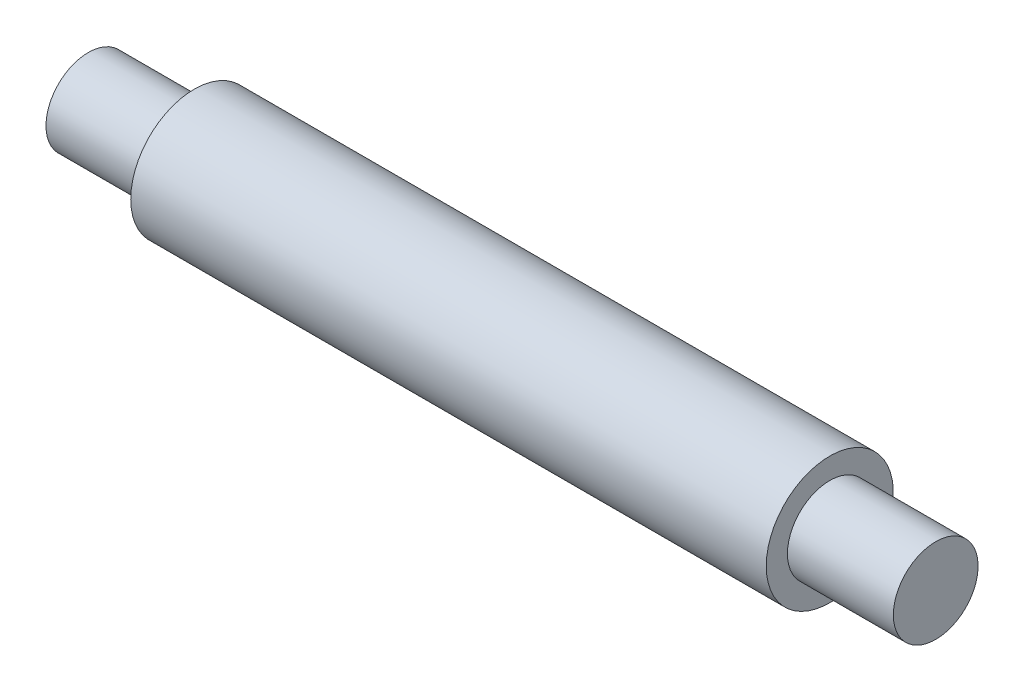
ISO-10303-21;
HEADER;
FILE_DESCRIPTION(('STEP AP214'),'2;1');
FILE_NAME('part.step','',(''),(''),'','','');
FILE_SCHEMA(('AUTOMOTIVE_DESIGN { 1 0 10303 214 1 1 1 1 }'));
ENDSEC;
DATA;
#1=APPLICATION_CONTEXT('core data for automotive mechanical design processes');
#2=APPLICATION_PROTOCOL_DEFINITION('international standard','automotive_design',2000,#1);
#3=PRODUCT_CONTEXT('',#1,'mechanical');
#4=PRODUCT('Part','Part','',(#3));
#5=PRODUCT_RELATED_PRODUCT_CATEGORY('part','',(#4));
#6=PRODUCT_DEFINITION_FORMATION('','',#4);
#7=PRODUCT_DEFINITION_CONTEXT('part definition',#1,'design');
#8=PRODUCT_DEFINITION('design','',#6,#7);
#9=PRODUCT_DEFINITION_SHAPE('','',#8);
#10=(LENGTH_UNIT() NAMED_UNIT(*) SI_UNIT(.MILLI.,.METRE.));
#11=(NAMED_UNIT(*) PLANE_ANGLE_UNIT() SI_UNIT($,.RADIAN.));
#12=(NAMED_UNIT(*) SI_UNIT($,.STERADIAN.) SOLID_ANGLE_UNIT());
#13=UNCERTAINTY_MEASURE_WITH_UNIT(LENGTH_MEASURE(1.E-05),#10,'distance_accuracy_value','');
#14=(GEOMETRIC_REPRESENTATION_CONTEXT(3) GLOBAL_UNCERTAINTY_ASSIGNED_CONTEXT((#13)) GLOBAL_UNIT_ASSIGNED_CONTEXT((#10,
#11,#12)) REPRESENTATION_CONTEXT('',''));
#15=CARTESIAN_POINT('',(0.,0.,0.));
#16=DIRECTION('',(0.,0.,1.));
#17=DIRECTION('',(1.,0.,0.));
#18=AXIS2_PLACEMENT_3D('',#15,#16,#17);
#19=CARTESIAN_POINT('',(0.,0.,0.));
#20=DIRECTION('',(1.,0.,0.));
#21=DIRECTION('',(0.,0.,-1.));
#22=AXIS2_PLACEMENT_3D('',#19,#20,#21);
#23=PLANE('',#22);
#24=CARTESIAN_POINT('',(0.,0.,0.));
#25=DIRECTION('',(-1.,0.,0.));
#26=DIRECTION('',(0.,0.,1.));
#27=AXIS2_PLACEMENT_3D('',#24,#25,#26);
#28=CIRCLE('',#27,4.);
#29=CARTESIAN_POINT('',(0.,0.,4.));
#30=VERTEX_POINT('',#29);
#31=EDGE_CURVE('E10',#30,#30,#28,.T.);
#32=ORIENTED_EDGE('',*,*,#31,.T.);
#33=EDGE_LOOP('',(#32));
#34=FACE_BOUND('',#33,.T.);
#35=ADVANCED_FACE('F37',(#34),#23,.F.);
#36=CARTESIAN_POINT('',(0.,0.,0.));
#37=DIRECTION('',(-1.,0.,0.));
#38=DIRECTION('',(0.,0.,1.));
#39=AXIS2_PLACEMENT_3D('',#36,#37,#38);
#40=CYLINDRICAL_SURFACE('',#39,4.);
#41=ORIENTED_EDGE('',*,*,#31,.F.);
#42=EDGE_LOOP('',(#41));
#43=FACE_BOUND('',#42,.T.);
#44=CARTESIAN_POINT('',(10.,0.,0.));
#45=DIRECTION('',(-1.,0.,0.));
#46=DIRECTION('',(0.,0.,1.));
#47=AXIS2_PLACEMENT_3D('',#44,#45,#46);
#48=CIRCLE('',#47,4.);
#49=CARTESIAN_POINT('',(10.,0.,4.));
#50=VERTEX_POINT('',#49);
#51=EDGE_CURVE('E44',#50,#50,#48,.T.);
#52=ORIENTED_EDGE('',*,*,#51,.T.);
#53=EDGE_LOOP('',(#52));
#54=FACE_BOUND('',#53,.T.);
#55=ADVANCED_FACE('F81',(#43,#54),#40,.T.);
#56=CARTESIAN_POINT('',(10.,4.,0.));
#57=DIRECTION('',(1.,0.,0.));
#58=DIRECTION('',(0.,0.,-1.));
#59=AXIS2_PLACEMENT_3D('',#56,#57,#58);
#60=PLANE('',#59);
#61=ORIENTED_EDGE('',*,*,#51,.F.);
#62=EDGE_LOOP('',(#61));
#63=FACE_BOUND('',#62,.T.);
#64=CARTESIAN_POINT('',(10.,0.,0.));
#65=DIRECTION('',(-1.,0.,0.));
#66=DIRECTION('',(0.,0.,1.));
#67=AXIS2_PLACEMENT_3D('',#64,#65,#66);
#68=CIRCLE('',#67,6.);
#69=CARTESIAN_POINT('',(10.,0.,6.));
#70=VERTEX_POINT('',#69);
#71=EDGE_CURVE('E49',#70,#70,#68,.T.);
#72=ORIENTED_EDGE('',*,*,#71,.T.);
#73=EDGE_LOOP('',(#72));
#74=FACE_BOUND('',#73,.T.);
#75=ADVANCED_FACE('F85',(#63,#74),#60,.F.);
#76=CARTESIAN_POINT('',(0.,0.,0.));
#77=DIRECTION('',(-1.,0.,0.));
#78=DIRECTION('',(0.,0.,1.));
#79=AXIS2_PLACEMENT_3D('',#76,#77,#78);
#80=CYLINDRICAL_SURFACE('',#79,6.);
#81=ORIENTED_EDGE('',*,*,#71,.F.);
#82=EDGE_LOOP('',(#81));
#83=FACE_BOUND('',#82,.T.);
#84=CARTESIAN_POINT('',(70.,0.,0.));
#85=DIRECTION('',(-1.,0.,0.));
#86=DIRECTION('',(0.,0.,1.));
#87=AXIS2_PLACEMENT_3D('',#84,#85,#86);
#88=CIRCLE('',#87,6.);
#89=CARTESIAN_POINT('',(70.,0.,6.));
#90=VERTEX_POINT('',#89);
#91=EDGE_CURVE('E54',#90,#90,#88,.T.);
#92=ORIENTED_EDGE('',*,*,#91,.T.);
#93=EDGE_LOOP('',(#92));
#94=FACE_BOUND('',#93,.T.);
#95=ADVANCED_FACE('F90',(#83,#94),#80,.T.);
#96=CARTESIAN_POINT('',(70.,6.,0.));
#97=DIRECTION('',(-1.,0.,0.));
#98=DIRECTION('',(0.,0.,1.));
#99=AXIS2_PLACEMENT_3D('',#96,#97,#98);
#100=PLANE('',#99);
#101=ORIENTED_EDGE('',*,*,#91,.F.);
#102=EDGE_LOOP('',(#101));
#103=FACE_BOUND('',#102,.T.);
#104=CARTESIAN_POINT('',(70.,0.,0.));
#105=DIRECTION('',(-1.,0.,0.));
#106=DIRECTION('',(0.,0.,1.));
#107=AXIS2_PLACEMENT_3D('',#104,#105,#106);
#108=CIRCLE('',#107,4.);
#109=CARTESIAN_POINT('',(70.,0.,4.));
#110=VERTEX_POINT('',#109);
#111=EDGE_CURVE('E60',#110,#110,#108,.T.);
#112=ORIENTED_EDGE('',*,*,#111,.T.);
#113=EDGE_LOOP('',(#112));
#114=FACE_BOUND('',#113,.T.);
#115=ADVANCED_FACE('F77',(#103,#114),#100,.F.);
#116=CARTESIAN_POINT('',(0.,0.,0.));
#117=DIRECTION('',(-1.,0.,0.));
#118=DIRECTION('',(0.,0.,1.));
#119=AXIS2_PLACEMENT_3D('',#116,#117,#118);
#120=CYLINDRICAL_SURFACE('',#119,4.);
#121=ORIENTED_EDGE('',*,*,#111,.F.);
#122=EDGE_LOOP('',(#121));
#123=FACE_BOUND('',#122,.T.);
#124=CARTESIAN_POINT('',(80.,0.,0.));
#125=DIRECTION('',(-1.,0.,0.));
#126=DIRECTION('',(0.,0.,1.));
#127=AXIS2_PLACEMENT_3D('',#124,#125,#126);
#128=CIRCLE('',#127,4.);
#129=CARTESIAN_POINT('',(80.,0.,4.));
#130=VERTEX_POINT('',#129);
#131=EDGE_CURVE('E64',#130,#130,#128,.T.);
#132=ORIENTED_EDGE('',*,*,#131,.T.);
#133=EDGE_LOOP('',(#132));
#134=FACE_BOUND('',#133,.T.);
#135=ADVANCED_FACE('F69',(#123,#134),#120,.T.);
#136=CARTESIAN_POINT('',(80.,4.,0.));
#137=DIRECTION('',(-1.,0.,0.));
#138=DIRECTION('',(0.,0.,1.));
#139=AXIS2_PLACEMENT_3D('',#136,#137,#138);
#140=PLANE('',#139);
#141=ORIENTED_EDGE('',*,*,#131,.F.);
#142=EDGE_LOOP('',(#141));
#143=FACE_BOUND('',#142,.T.);
#144=ADVANCED_FACE('F71',(#143),#140,.F.);
#145=CLOSED_SHELL('',(#35,#55,#75,#95,#115,#135,#144));
#146=MANIFOLD_SOLID_BREP('B2',#145);
#147=ADVANCED_BREP_SHAPE_REPRESENTATION('',(#18,#146),#14);
#148=SHAPE_DEFINITION_REPRESENTATION(#9,#147);
ENDSEC;
END-ISO-10303-21;
